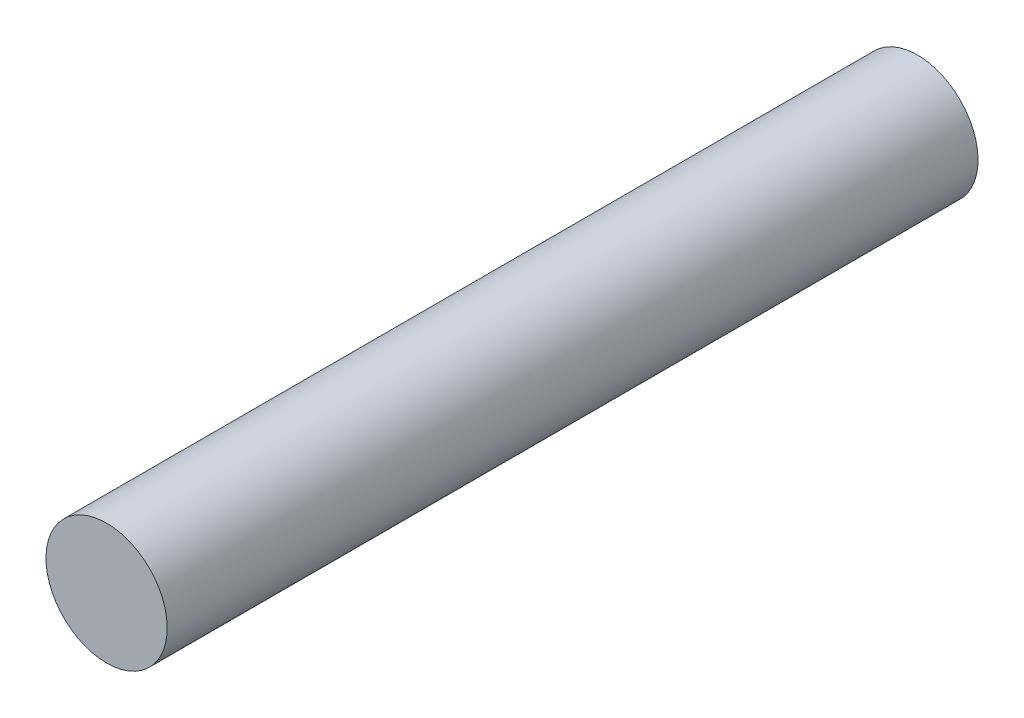
ISO-10303-21;
HEADER;
FILE_DESCRIPTION(('STEP AP214'),'2;1');
FILE_NAME('part.step','',(''),(''),'','','');
FILE_SCHEMA(('AUTOMOTIVE_DESIGN { 1 0 10303 214 1 1 1 1 }'));
ENDSEC;
DATA;
#1=APPLICATION_CONTEXT('core data for automotive mechanical design processes');
#2=APPLICATION_PROTOCOL_DEFINITION('international standard','automotive_design',2000,#1);
#3=PRODUCT_CONTEXT('',#1,'mechanical');
#4=PRODUCT('Part','Part','',(#3));
#5=PRODUCT_RELATED_PRODUCT_CATEGORY('part','',(#4));
#6=PRODUCT_DEFINITION_FORMATION('','',#4);
#7=PRODUCT_DEFINITION_CONTEXT('part definition',#1,'design');
#8=PRODUCT_DEFINITION('design','',#6,#7);
#9=PRODUCT_DEFINITION_SHAPE('','',#8);
#10=(LENGTH_UNIT() NAMED_UNIT(*) SI_UNIT(.MILLI.,.METRE.));
#11=(NAMED_UNIT(*) PLANE_ANGLE_UNIT() SI_UNIT($,.RADIAN.));
#12=(NAMED_UNIT(*) SI_UNIT($,.STERADIAN.) SOLID_ANGLE_UNIT());
#13=UNCERTAINTY_MEASURE_WITH_UNIT(LENGTH_MEASURE(1.E-05),#10,'distance_accuracy_value','');
#14=(GEOMETRIC_REPRESENTATION_CONTEXT(3) GLOBAL_UNCERTAINTY_ASSIGNED_CONTEXT((#13)) GLOBAL_UNIT_ASSIGNED_CONTEXT((#10,
#11,#12)) REPRESENTATION_CONTEXT('',''));
#15=CARTESIAN_POINT('',(0.,0.,0.));
#16=DIRECTION('',(0.,0.,1.));
#17=DIRECTION('',(1.,0.,0.));
#18=AXIS2_PLACEMENT_3D('',#15,#16,#17);
#19=CARTESIAN_POINT('',(0.,0.,70.8005875825776));
#20=DIRECTION('',(0.,0.,1.));
#21=DIRECTION('',(1.,0.,0.));
#22=AXIS2_PLACEMENT_3D('',#19,#20,#21);
#23=PLANE('',#22);
#24=CARTESIAN_POINT('',(0.,0.,70.8005875825776));
#25=DIRECTION('',(0.,0.,1.));
#26=DIRECTION('',(0.,-1.,0.));
#27=AXIS2_PLACEMENT_3D('',#24,#25,#26);
#28=CIRCLE('',#27,5.29336);
#29=CARTESIAN_POINT('',(0.,-5.29336000000001,70.8005875825776));
#30=VERTEX_POINT('',#29);
#31=EDGE_CURVE('E18',#30,#30,#28,.F.);
#32=ORIENTED_EDGE('',*,*,#31,.F.);
#33=EDGE_LOOP('',(#32));
#34=FACE_BOUND('',#33,.T.);
#35=ADVANCED_FACE('F15',(#34),#23,.T.);
#36=CARTESIAN_POINT('',(0.,0.,0.));
#37=DIRECTION('',(0.,0.,1.));
#38=DIRECTION('',(1.,0.,0.));
#39=AXIS2_PLACEMENT_3D('',#36,#37,#38);
#40=PLANE('',#39);
#41=CARTESIAN_POINT('',(0.,0.,0.));
#42=DIRECTION('',(0.,0.,1.));
#43=DIRECTION('',(0.,-1.,0.));
#44=AXIS2_PLACEMENT_3D('',#41,#42,#43);
#45=CIRCLE('',#44,5.29336);
#46=CARTESIAN_POINT('',(0.,-5.29336,0.));
#47=VERTEX_POINT('',#46);
#48=EDGE_CURVE('E10',#47,#47,#45,.T.);
#49=ORIENTED_EDGE('',*,*,#48,.F.);
#50=EDGE_LOOP('',(#49));
#51=FACE_BOUND('',#50,.T.);
#52=ADVANCED_FACE('F30',(#51),#40,.F.);
#53=CARTESIAN_POINT('',(0.,0.,0.));
#54=DIRECTION('',(0.,0.,1.));
#55=DIRECTION('',(0.,-1.,0.));
#56=AXIS2_PLACEMENT_3D('',#53,#54,#55);
#57=CYLINDRICAL_SURFACE('',#56,5.29336);
#58=ORIENTED_EDGE('',*,*,#31,.T.);
#59=EDGE_LOOP('',(#58));
#60=FACE_BOUND('',#59,.T.);
#61=ORIENTED_EDGE('',*,*,#48,.T.);
#62=EDGE_LOOP('',(#61));
#63=FACE_BOUND('',#62,.T.);
#64=ADVANCED_FACE('F27',(#60,#63),#57,.T.);
#65=CLOSED_SHELL('',(#35,#52,#64));
#66=MANIFOLD_SOLID_BREP('B1',#65);
#67=ADVANCED_BREP_SHAPE_REPRESENTATION('',(#18,#66),#14);
#68=SHAPE_DEFINITION_REPRESENTATION(#9,#67);
ENDSEC;
END-ISO-10303-21;
